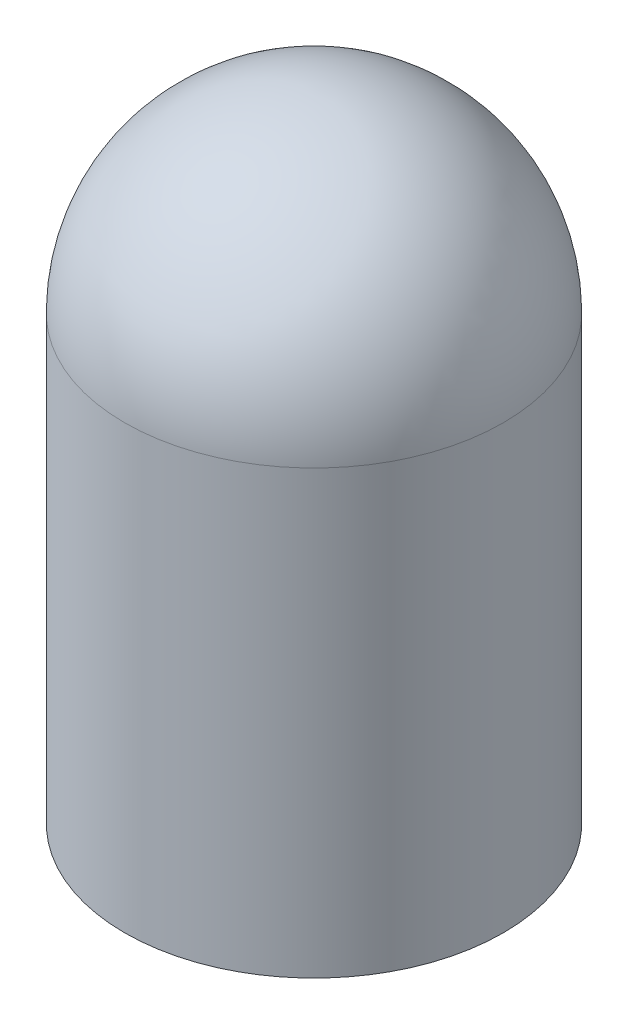
ISO-10303-21;
HEADER;
FILE_DESCRIPTION(('STEP AP214'),'2;1');
FILE_NAME('part.step','',(''),(''),'','','');
FILE_SCHEMA(('AUTOMOTIVE_DESIGN { 1 0 10303 214 1 1 1 1 }'));
ENDSEC;
DATA;
#1=APPLICATION_CONTEXT('core data for automotive mechanical design processes');
#2=APPLICATION_PROTOCOL_DEFINITION('international standard','automotive_design',2000,#1);
#3=PRODUCT_CONTEXT('',#1,'mechanical');
#4=PRODUCT('Part','Part','',(#3));
#5=PRODUCT_RELATED_PRODUCT_CATEGORY('part','',(#4));
#6=PRODUCT_DEFINITION_FORMATION('','',#4);
#7=PRODUCT_DEFINITION_CONTEXT('part definition',#1,'design');
#8=PRODUCT_DEFINITION('design','',#6,#7);
#9=PRODUCT_DEFINITION_SHAPE('','',#8);
#10=(LENGTH_UNIT() NAMED_UNIT(*) SI_UNIT(.MILLI.,.METRE.));
#11=(NAMED_UNIT(*) PLANE_ANGLE_UNIT() SI_UNIT($,.RADIAN.));
#12=(NAMED_UNIT(*) SI_UNIT($,.STERADIAN.) SOLID_ANGLE_UNIT());
#13=UNCERTAINTY_MEASURE_WITH_UNIT(LENGTH_MEASURE(1.E-05),#10,'distance_accuracy_value','');
#14=(GEOMETRIC_REPRESENTATION_CONTEXT(3) GLOBAL_UNCERTAINTY_ASSIGNED_CONTEXT((#13)) GLOBAL_UNIT_ASSIGNED_CONTEXT((#10,
#11,#12)) REPRESENTATION_CONTEXT('',''));
#15=CARTESIAN_POINT('',(0.,0.,0.));
#16=DIRECTION('',(0.,0.,1.));
#17=DIRECTION('',(1.,0.,0.));
#18=AXIS2_PLACEMENT_3D('',#15,#16,#17);
#19=CARTESIAN_POINT('',(0.,0.,0.));
#20=DIRECTION('',(0.,1.,0.));
#21=DIRECTION('',(-1.,0.,0.));
#22=AXIS2_PLACEMENT_3D('',#19,#20,#21);
#23=PLANE('',#22);
#24=CARTESIAN_POINT('',(0.,0.,0.));
#25=DIRECTION('',(0.,1.,0.));
#26=DIRECTION('',(-1.,0.,0.));
#27=AXIS2_PLACEMENT_3D('',#24,#25,#26);
#28=CIRCLE('',#27,58.);
#29=CARTESIAN_POINT('',(-58.,0.,0.));
#30=VERTEX_POINT('',#29);
#31=EDGE_CURVE('E43',#30,#30,#28,.T.);
#32=ORIENTED_EDGE('',*,*,#31,.T.);
#33=EDGE_LOOP('',(#32));
#34=FACE_BOUND('',#33,.T.);
#35=CARTESIAN_POINT('',(0.,0.,0.));
#36=DIRECTION('',(0.,1.,0.));
#37=DIRECTION('',(-1.,0.,0.));
#38=AXIS2_PLACEMENT_3D('',#35,#36,#37);
#39=CIRCLE('',#38,60.);
#40=CARTESIAN_POINT('',(-60.,0.,0.));
#41=VERTEX_POINT('',#40);
#42=EDGE_CURVE('E10',#41,#41,#39,.T.);
#43=ORIENTED_EDGE('',*,*,#42,.F.);
#44=EDGE_LOOP('',(#43));
#45=FACE_BOUND('',#44,.T.);
#46=ADVANCED_FACE('F33',(#34,#45),#23,.F.);
#47=CARTESIAN_POINT('',(0.,200.,0.));
#48=DIRECTION('',(0.,1.,0.));
#49=DIRECTION('',(-1.,0.,0.));
#50=AXIS2_PLACEMENT_3D('',#47,#48,#49);
#51=CYLINDRICAL_SURFACE('',#50,60.);
#52=CARTESIAN_POINT('',(0.,140.,0.));
#53=DIRECTION('',(0.,1.,0.));
#54=DIRECTION('',(-1.,0.,0.));
#55=AXIS2_PLACEMENT_3D('',#52,#53,#54);
#56=CIRCLE('',#55,60.);
#57=CARTESIAN_POINT('',(-60.,140.,0.));
#58=VERTEX_POINT('',#57);
#59=EDGE_CURVE('E39',#58,#58,#56,.T.);
#60=ORIENTED_EDGE('',*,*,#59,.F.);
#61=EDGE_LOOP('',(#60));
#62=FACE_BOUND('',#61,.T.);
#63=ORIENTED_EDGE('',*,*,#42,.T.);
#64=EDGE_LOOP('',(#63));
#65=FACE_BOUND('',#64,.T.);
#66=ADVANCED_FACE('F66',(#62,#65),#51,.T.);
#67=CARTESIAN_POINT('',(0.,140.,0.));
#68=DIRECTION('',(0.,1.,0.));
#69=DIRECTION('',(1.,0.,0.));
#70=AXIS2_PLACEMENT_3D('',#67,#68,#69);
#71=SPHERICAL_SURFACE('',#70,60.);
#72=ORIENTED_EDGE('',*,*,#59,.T.);
#73=EDGE_LOOP('',(#72));
#74=FACE_BOUND('',#73,.T.);
#75=ADVANCED_FACE('F62',(#74),#71,.T.);
#76=CARTESIAN_POINT('',(0.,200.,0.));
#77=DIRECTION('',(0.,1.,0.));
#78=DIRECTION('',(-1.,0.,0.));
#79=AXIS2_PLACEMENT_3D('',#76,#77,#78);
#80=CYLINDRICAL_SURFACE('',#79,58.);
#81=CARTESIAN_POINT('',(0.,140.,0.));
#82=DIRECTION('',(0.,1.,0.));
#83=DIRECTION('',(-1.,0.,0.));
#84=AXIS2_PLACEMENT_3D('',#81,#82,#83);
#85=CIRCLE('',#84,58.);
#86=CARTESIAN_POINT('',(-58.,140.,0.));
#87=VERTEX_POINT('',#86);
#88=EDGE_CURVE('E47',#87,#87,#85,.T.);
#89=ORIENTED_EDGE('',*,*,#88,.T.);
#90=EDGE_LOOP('',(#89));
#91=FACE_BOUND('',#90,.T.);
#92=ORIENTED_EDGE('',*,*,#31,.F.);
#93=EDGE_LOOP('',(#92));
#94=FACE_BOUND('',#93,.T.);
#95=ADVANCED_FACE('F53',(#91,#94),#80,.F.);
#96=CARTESIAN_POINT('',(0.,140.,0.));
#97=DIRECTION('',(0.,1.,0.));
#98=DIRECTION('',(1.,0.,0.));
#99=AXIS2_PLACEMENT_3D('',#96,#97,#98);
#100=SPHERICAL_SURFACE('',#99,58.);
#101=ORIENTED_EDGE('',*,*,#88,.F.);
#102=EDGE_LOOP('',(#101));
#103=FACE_BOUND('',#102,.T.);
#104=ADVANCED_FACE('F56',(#103),#100,.F.);
#105=CLOSED_SHELL('',(#46,#66,#75,#95,#104));
#106=MANIFOLD_SOLID_BREP('B2',#105);
#107=ADVANCED_BREP_SHAPE_REPRESENTATION('',(#18,#106),#14);
#108=SHAPE_DEFINITION_REPRESENTATION(#9,#107);
ENDSEC;
END-ISO-10303-21;
